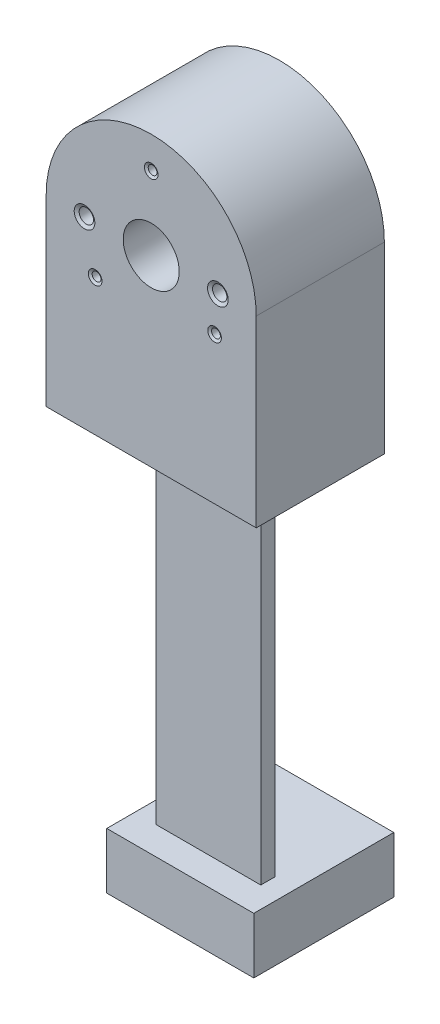
ISO-10303-21;
HEADER;
FILE_DESCRIPTION(('STEP AP214'),'2;1');
FILE_NAME('part.step','',(''),(''),'','','');
FILE_SCHEMA(('AUTOMOTIVE_DESIGN { 1 0 10303 214 1 1 1 1 }'));
ENDSEC;
DATA;
#1=APPLICATION_CONTEXT('core data for automotive mechanical design processes');
#2=APPLICATION_PROTOCOL_DEFINITION('international standard','automotive_design',2000,#1);
#3=PRODUCT_CONTEXT('',#1,'mechanical');
#4=PRODUCT('Part','Part','',(#3));
#5=PRODUCT_RELATED_PRODUCT_CATEGORY('part','',(#4));
#6=PRODUCT_DEFINITION_FORMATION('','',#4);
#7=PRODUCT_DEFINITION_CONTEXT('part definition',#1,'design');
#8=PRODUCT_DEFINITION('design','',#6,#7);
#9=PRODUCT_DEFINITION_SHAPE('','',#8);
#10=(LENGTH_UNIT() NAMED_UNIT(*) SI_UNIT(.MILLI.,.METRE.));
#11=(NAMED_UNIT(*) PLANE_ANGLE_UNIT() SI_UNIT($,.RADIAN.));
#12=(NAMED_UNIT(*) SI_UNIT($,.STERADIAN.) SOLID_ANGLE_UNIT());
#13=UNCERTAINTY_MEASURE_WITH_UNIT(LENGTH_MEASURE(1.E-05),#10,'distance_accuracy_value','');
#14=(GEOMETRIC_REPRESENTATION_CONTEXT(3) GLOBAL_UNCERTAINTY_ASSIGNED_CONTEXT((#13)) GLOBAL_UNIT_ASSIGNED_CONTEXT((#10,
#11,#12)) REPRESENTATION_CONTEXT('',''));
#15=CARTESIAN_POINT('',(0.,0.,0.));
#16=DIRECTION('',(0.,0.,1.));
#17=DIRECTION('',(1.,0.,0.));
#18=AXIS2_PLACEMENT_3D('',#15,#16,#17);
#19=CARTESIAN_POINT('',(-315.950034530453,190.975,13.3000000000152));
#20=DIRECTION('',(0.,0.,1.));
#21=DIRECTION('',(1.,0.,0.));
#22=AXIS2_PLACEMENT_3D('',#19,#20,#21);
#23=CONICAL_SURFACE('',#22,0.625000000092579,1.02974425865527);
#24=CARTESIAN_POINT('',(-315.950034530346,190.975,12.9244621130056));
#25=VERTEX_POINT('',#24);
#26=VERTEX_LOOP('',#25);
#27=FACE_BOUND('',#26,.T.);
#28=CARTESIAN_POINT('',(-315.950034530453,190.975,13.3));
#29=DIRECTION('',(0.,0.,1.));
#30=DIRECTION('',(1.,0.,0.));
#31=AXIS2_PLACEMENT_3D('',#28,#29,#30);
#32=CIRCLE('',#31,0.625);
#33=CARTESIAN_POINT('',(-315.325034530453,190.975,13.3));
#34=VERTEX_POINT('',#33);
#35=EDGE_CURVE('E115',#34,#34,#32,.T.);
#36=ORIENTED_EDGE('',*,*,#35,.T.);
#37=EDGE_LOOP('',(#36));
#38=FACE_BOUND('',#37,.T.);
#39=ADVANCED_FACE('F17',(#27,#38),#23,.F.);
#40=CARTESIAN_POINT('',(-315.475,196.2,10.8000000000175));
#41=DIRECTION('',(0.,0.,1.));
#42=DIRECTION('',(1.,0.,0.));
#43=AXIS2_PLACEMENT_3D('',#40,#41,#42);
#44=CONICAL_SURFACE('',#43,1.0249999999779,1.02974425866427);
#45=CARTESIAN_POINT('',(-315.475000000049,196.2,10.1841178655206));
#46=VERTEX_POINT('',#45);
#47=VERTEX_LOOP('',#46);
#48=FACE_BOUND('',#47,.T.);
#49=CARTESIAN_POINT('',(-315.475,196.2,10.8));
#50=DIRECTION('',(0.,0.,1.));
#51=DIRECTION('',(1.,0.,0.));
#52=AXIS2_PLACEMENT_3D('',#49,#50,#51);
#53=CIRCLE('',#52,1.025);
#54=CARTESIAN_POINT('',(-314.45,196.2,10.8));
#55=VERTEX_POINT('',#54);
#56=EDGE_CURVE('E117',#55,#55,#53,.T.);
#57=ORIENTED_EDGE('',*,*,#56,.T.);
#58=EDGE_LOOP('',(#57));
#59=FACE_BOUND('',#58,.T.);
#60=ADVANCED_FACE('F112',(#48,#59),#44,.F.);
#61=CARTESIAN_POINT('',(-333.005164430593,189.482869478776,13.300000000072));
#62=DIRECTION('',(0.,0.,1.));
#63=DIRECTION('',(1.,0.,0.));
#64=AXIS2_PLACEMENT_3D('',#61,#62,#63);
#65=CONICAL_SURFACE('',#64,0.625000000032627,1.02974425868194);
#66=CARTESIAN_POINT('',(-333.005164430517,189.482869478776,12.9244621131761));
#67=VERTEX_POINT('',#66);
#68=VERTEX_LOOP('',#67);
#69=FACE_BOUND('',#68,.T.);
#70=CARTESIAN_POINT('',(-333.005164430593,189.482869478776,13.3));
#71=DIRECTION('',(0.,0.,1.));
#72=DIRECTION('',(1.,0.,0.));
#73=AXIS2_PLACEMENT_3D('',#70,#71,#72);
#74=CIRCLE('',#73,0.625);
#75=CARTESIAN_POINT('',(-332.380164430593,189.482869478776,13.3));
#76=VERTEX_POINT('',#75);
#77=EDGE_CURVE('E120',#76,#76,#74,.T.);
#78=ORIENTED_EDGE('',*,*,#77,.T.);
#79=EDGE_LOOP('',(#78));
#80=FACE_BOUND('',#79,.T.);
#81=ADVANCED_FACE('F233',(#69,#80),#65,.F.);
#82=CARTESIAN_POINT('',(-334.525,196.2,10.8000000001311));
#83=DIRECTION('',(0.,0.,1.));
#84=DIRECTION('',(1.,0.,0.));
#85=AXIS2_PLACEMENT_3D('',#82,#83,#84);
#86=CONICAL_SURFACE('',#85,1.02500000015548,1.02974425865623);
#87=CARTESIAN_POINT('',(-334.525000000127,196.2,10.1841178655491));
#88=VERTEX_POINT('',#87);
#89=VERTEX_LOOP('',#88);
#90=FACE_BOUND('',#89,.T.);
#91=CARTESIAN_POINT('',(-334.525,196.2,10.8));
#92=DIRECTION('',(0.,0.,1.));
#93=DIRECTION('',(1.,0.,0.));
#94=AXIS2_PLACEMENT_3D('',#91,#92,#93);
#95=CIRCLE('',#94,1.025);
#96=CARTESIAN_POINT('',(-333.5,196.2,10.8));
#97=VERTEX_POINT('',#96);
#98=EDGE_CURVE('E228',#97,#97,#95,.T.);
#99=ORIENTED_EDGE('',*,*,#98,.T.);
#100=EDGE_LOOP('',(#99));
#101=FACE_BOUND('',#100,.T.);
#102=ADVANCED_FACE('F359',(#90,#101),#86,.F.);
#103=CARTESIAN_POINT('',(-325.,206.65,13.2999999999583));
#104=DIRECTION('',(0.,0.,1.));
#105=DIRECTION('',(0.,-1.,0.));
#106=AXIS2_PLACEMENT_3D('',#103,#104,#105);
#107=CONICAL_SURFACE('',#106,0.624999999968179,1.02974425861771);
#108=CARTESIAN_POINT('',(-324.999999999932,206.65,12.9244621130908));
#109=VERTEX_POINT('',#108);
#110=VERTEX_LOOP('',#109);
#111=FACE_BOUND('',#110,.T.);
#112=CARTESIAN_POINT('',(-325.,206.65,13.3));
#113=DIRECTION('',(0.,0.,1.));
#114=DIRECTION('',(1.,0.,0.));
#115=AXIS2_PLACEMENT_3D('',#112,#113,#114);
#116=CIRCLE('',#115,0.625);
#117=CARTESIAN_POINT('',(-324.375,206.65,13.3));
#118=VERTEX_POINT('',#117);
#119=EDGE_CURVE('E225',#118,#118,#116,.T.);
#120=ORIENTED_EDGE('',*,*,#119,.T.);
#121=EDGE_LOOP('',(#120));
#122=FACE_BOUND('',#121,.T.);
#123=ADVANCED_FACE('F355',(#111,#122),#107,.F.);
#124=CARTESIAN_POINT('',(-325.,110.,9.15));
#125=DIRECTION('',(0.,-1.,0.));
#126=DIRECTION('',(0.,0.,-1.));
#127=AXIS2_PLACEMENT_3D('',#124,#125,#126);
#128=PLANE('',#127);
#129=DIRECTION('',(-1.,0.,0.));
#130=VECTOR('',#129,1.);
#131=CARTESIAN_POINT('',(-332.5,110.,14.15));
#132=LINE('',#131,#130);
#133=CARTESIAN_POINT('',(-314.5,110.,14.15));
#134=VERTEX_POINT('',#133);
#135=CARTESIAN_POINT('',(-335.5,110.,14.15));
#136=VERTEX_POINT('',#135);
#137=EDGE_CURVE('E190',#134,#136,#132,.T.);
#138=ORIENTED_EDGE('',*,*,#137,.T.);
#139=DIRECTION('',(0.,0.,1.));
#140=VECTOR('',#139,1.);
#141=CARTESIAN_POINT('',(-335.5,110.,9.15));
#142=LINE('',#141,#140);
#143=CARTESIAN_POINT('',(-335.5,110.,-5.85));
#144=VERTEX_POINT('',#143);
#145=EDGE_CURVE('E223',#144,#136,#142,.T.);
#146=ORIENTED_EDGE('',*,*,#145,.F.);
#147=DIRECTION('',(1.,0.,0.));
#148=VECTOR('',#147,1.);
#149=CARTESIAN_POINT('',(-332.5,110.,-5.85));
#150=LINE('',#149,#148);
#151=CARTESIAN_POINT('',(-314.5,110.,-5.85));
#152=VERTEX_POINT('',#151);
#153=EDGE_CURVE('E218',#144,#152,#150,.T.);
#154=ORIENTED_EDGE('',*,*,#153,.T.);
#155=DIRECTION('',(0.,0.,1.));
#156=VECTOR('',#155,1.);
#157=CARTESIAN_POINT('',(-314.5,110.,9.15));
#158=LINE('',#157,#156);
#159=EDGE_CURVE('E213',#152,#134,#158,.T.);
#160=ORIENTED_EDGE('',*,*,#159,.T.);
#161=EDGE_LOOP('',(#138,#146,#154,#160));
#162=FACE_BOUND('',#161,.T.);
#163=ADVANCED_FACE('F351',(#162),#128,.T.);
#164=CARTESIAN_POINT('',(-335.5,140.,9.15));
#165=DIRECTION('',(-1.,0.,0.));
#166=DIRECTION('',(0.,0.,1.));
#167=AXIS2_PLACEMENT_3D('',#164,#165,#166);
#168=PLANE('',#167);
#169=ORIENTED_EDGE('',*,*,#145,.T.);
#170=DIRECTION('',(0.,1.,0.));
#171=VECTOR('',#170,1.);
#172=CARTESIAN_POINT('',(-335.5,118.,14.15));
#173=LINE('',#172,#171);
#174=CARTESIAN_POINT('',(-335.5,118.,14.15));
#175=VERTEX_POINT('',#174);
#176=EDGE_CURVE('E210',#136,#175,#173,.T.);
#177=ORIENTED_EDGE('',*,*,#176,.T.);
#178=DIRECTION('',(0.,0.,-1.));
#179=VECTOR('',#178,1.);
#180=CARTESIAN_POINT('',(-335.5,118.,-5.85));
#181=LINE('',#180,#179);
#182=CARTESIAN_POINT('',(-335.5,118.,-5.85));
#183=VERTEX_POINT('',#182);
#184=EDGE_CURVE('E187',#175,#183,#181,.T.);
#185=ORIENTED_EDGE('',*,*,#184,.T.);
#186=DIRECTION('',(0.,1.,0.));
#187=VECTOR('',#186,1.);
#188=CARTESIAN_POINT('',(-335.5,110.,-5.85));
#189=LINE('',#188,#187);
#190=EDGE_CURVE('E220',#183,#144,#189,.F.);
#191=ORIENTED_EDGE('',*,*,#190,.T.);
#192=EDGE_LOOP('',(#169,#177,#185,#191));
#193=FACE_BOUND('',#192,.T.);
#194=ADVANCED_FACE('F347',(#193),#168,.T.);
#195=CARTESIAN_POINT('',(-332.5,110.,-5.85));
#196=DIRECTION('',(0.,0.,1.));
#197=DIRECTION('',(1.,0.,0.));
#198=AXIS2_PLACEMENT_3D('',#195,#196,#197);
#199=PLANE('',#198);
#200=DIRECTION('',(0.,1.,0.));
#201=VECTOR('',#200,1.);
#202=CARTESIAN_POINT('',(-314.5,140.,-5.85));
#203=LINE('',#202,#201);
#204=CARTESIAN_POINT('',(-314.5,118.,-5.85));
#205=VERTEX_POINT('',#204);
#206=EDGE_CURVE('E215',#205,#152,#203,.F.);
#207=ORIENTED_EDGE('',*,*,#206,.T.);
#208=ORIENTED_EDGE('',*,*,#153,.F.);
#209=ORIENTED_EDGE('',*,*,#190,.F.);
#210=DIRECTION('',(1.,0.,0.));
#211=VECTOR('',#210,1.);
#212=CARTESIAN_POINT('',(-332.5,118.,-5.85));
#213=LINE('',#212,#211);
#214=EDGE_CURVE('E184',#183,#205,#213,.T.);
#215=ORIENTED_EDGE('',*,*,#214,.T.);
#216=EDGE_LOOP('',(#207,#208,#209,#215));
#217=FACE_BOUND('',#216,.T.);
#218=ADVANCED_FACE('F343',(#217),#199,.F.);
#219=CARTESIAN_POINT('',(-314.5,140.,9.15));
#220=DIRECTION('',(-1.,0.,0.));
#221=DIRECTION('',(0.,0.,1.));
#222=AXIS2_PLACEMENT_3D('',#219,#220,#221);
#223=PLANE('',#222);
#224=ORIENTED_EDGE('',*,*,#159,.F.);
#225=ORIENTED_EDGE('',*,*,#206,.F.);
#226=DIRECTION('',(0.,0.,-1.));
#227=VECTOR('',#226,1.);
#228=CARTESIAN_POINT('',(-314.5,118.,-5.85));
#229=LINE('',#228,#227);
#230=CARTESIAN_POINT('',(-314.5,118.,14.15));
#231=VERTEX_POINT('',#230);
#232=EDGE_CURVE('E181',#205,#231,#229,.F.);
#233=ORIENTED_EDGE('',*,*,#232,.T.);
#234=DIRECTION('',(0.,1.,0.));
#235=VECTOR('',#234,1.);
#236=CARTESIAN_POINT('',(-314.5,118.,14.15));
#237=LINE('',#236,#235);
#238=EDGE_CURVE('E207',#231,#134,#237,.F.);
#239=ORIENTED_EDGE('',*,*,#238,.T.);
#240=EDGE_LOOP('',(#224,#225,#233,#239));
#241=FACE_BOUND('',#240,.T.);
#242=ADVANCED_FACE('F339',(#241),#223,.F.);
#243=CARTESIAN_POINT('',(-332.5,118.,14.15));
#244=DIRECTION('',(0.,0.,-1.));
#245=DIRECTION('',(-1.,0.,0.));
#246=AXIS2_PLACEMENT_3D('',#243,#244,#245);
#247=PLANE('',#246);
#248=ORIENTED_EDGE('',*,*,#238,.F.);
#249=DIRECTION('',(1.,0.,0.));
#250=VECTOR('',#249,1.);
#251=CARTESIAN_POINT('',(-332.5,118.,14.15));
#252=LINE('',#251,#250);
#253=EDGE_CURVE('E177',#231,#175,#252,.F.);
#254=ORIENTED_EDGE('',*,*,#253,.T.);
#255=ORIENTED_EDGE('',*,*,#176,.F.);
#256=ORIENTED_EDGE('',*,*,#137,.F.);
#257=EDGE_LOOP('',(#248,#254,#255,#256));
#258=FACE_BOUND('',#257,.T.);
#259=ADVANCED_FACE('F336',(#258),#247,.F.);
#260=CARTESIAN_POINT('',(-315.950034530453,190.975,18.3));
#261=DIRECTION('',(0.,0.,1.));
#262=DIRECTION('',(1.,0.,0.));
#263=AXIS2_PLACEMENT_3D('',#260,#261,#262);
#264=CYLINDRICAL_SURFACE('',#263,0.625);
#265=ORIENTED_EDGE('',*,*,#35,.F.);
#266=EDGE_LOOP('',(#265));
#267=FACE_BOUND('',#266,.T.);
#268=CARTESIAN_POINT('',(-315.950034530453,190.975,18.100000000004));
#269=DIRECTION('',(0.,0.,1.));
#270=DIRECTION('',(1.,0.,0.));
#271=AXIS2_PLACEMENT_3D('',#268,#269,#270);
#272=CIRCLE('',#271,0.624999999978892);
#273=CARTESIAN_POINT('',(-315.325034530474,190.975,18.100000000004));
#274=VERTEX_POINT('',#273);
#275=EDGE_CURVE('E180',#274,#274,#272,.T.);
#276=ORIENTED_EDGE('',*,*,#275,.T.);
#277=EDGE_LOOP('',(#276));
#278=FACE_BOUND('',#277,.T.);
#279=ADVANCED_FACE('F332',(#267,#278),#264,.F.);
#280=CARTESIAN_POINT('',(-315.475,196.2,18.3));
#281=DIRECTION('',(0.,0.,1.));
#282=DIRECTION('',(1.,0.,0.));
#283=AXIS2_PLACEMENT_3D('',#280,#281,#282);
#284=CYLINDRICAL_SURFACE('',#283,1.025);
#285=ORIENTED_EDGE('',*,*,#56,.F.);
#286=EDGE_LOOP('',(#285));
#287=FACE_BOUND('',#286,.T.);
#288=CARTESIAN_POINT('',(-315.475,196.2,18.0401923789191));
#289=DIRECTION('',(0.,0.,1.));
#290=DIRECTION('',(1.,0.,0.));
#291=AXIS2_PLACEMENT_3D('',#288,#289,#290);
#292=CIRCLE('',#291,1.0249999999779);
#293=CARTESIAN_POINT('',(-314.450000000022,196.2,18.0401923789191));
#294=VERTEX_POINT('',#293);
#295=EDGE_CURVE('E200',#294,#294,#292,.T.);
#296=ORIENTED_EDGE('',*,*,#295,.T.);
#297=EDGE_LOOP('',(#296));
#298=FACE_BOUND('',#297,.T.);
#299=ADVANCED_FACE('F239',(#287,#298),#284,.F.);
#300=CARTESIAN_POINT('',(-333.005164430593,189.482869478776,18.3));
#301=DIRECTION('',(0.,0.,1.));
#302=DIRECTION('',(1.,0.,0.));
#303=AXIS2_PLACEMENT_3D('',#300,#301,#302);
#304=CYLINDRICAL_SURFACE('',#303,0.625);
#305=ORIENTED_EDGE('',*,*,#77,.F.);
#306=EDGE_LOOP('',(#305));
#307=FACE_BOUND('',#306,.T.);
#308=CARTESIAN_POINT('',(-333.005164430593,189.482869478776,18.1000000000608));
#309=DIRECTION('',(0.,0.,1.));
#310=DIRECTION('',(1.,0.,0.));
#311=AXIS2_PLACEMENT_3D('',#308,#309,#310);
#312=CIRCLE('',#311,0.625000000032627);
#313=CARTESIAN_POINT('',(-332.38016443056,189.482869478776,18.1000000000608));
#314=VERTEX_POINT('',#313);
#315=EDGE_CURVE('E197',#314,#314,#312,.T.);
#316=ORIENTED_EDGE('',*,*,#315,.T.);
#317=EDGE_LOOP('',(#316));
#318=FACE_BOUND('',#317,.T.);
#319=ADVANCED_FACE('F235',(#307,#318),#304,.F.);
#320=CARTESIAN_POINT('',(-334.525,196.2,18.3));
#321=DIRECTION('',(0.,0.,1.));
#322=DIRECTION('',(1.,0.,0.));
#323=AXIS2_PLACEMENT_3D('',#320,#321,#322);
#324=CYLINDRICAL_SURFACE('',#323,1.025);
#325=ORIENTED_EDGE('',*,*,#98,.F.);
#326=EDGE_LOOP('',(#325));
#327=FACE_BOUND('',#326,.T.);
#328=CARTESIAN_POINT('',(-334.525,196.2,18.0401923788622));
#329=DIRECTION('',(0.,0.,1.));
#330=DIRECTION('',(1.,0.,0.));
#331=AXIS2_PLACEMENT_3D('',#328,#329,#330);
#332=CIRCLE('',#331,1.02499999998495);
#333=CARTESIAN_POINT('',(-333.500000000015,196.2,18.0401923788622));
#334=VERTEX_POINT('',#333);
#335=EDGE_CURVE('E194',#334,#334,#332,.T.);
#336=ORIENTED_EDGE('',*,*,#335,.T.);
#337=EDGE_LOOP('',(#336));
#338=FACE_BOUND('',#337,.T.);
#339=ADVANCED_FACE('F238',(#327,#338),#324,.F.);
#340=CARTESIAN_POINT('',(-325.,206.65,18.3));
#341=DIRECTION('',(0.,0.,1.));
#342=DIRECTION('',(1.,0.,0.));
#343=AXIS2_PLACEMENT_3D('',#340,#341,#342);
#344=CYLINDRICAL_SURFACE('',#343,0.625);
#345=ORIENTED_EDGE('',*,*,#119,.F.);
#346=EDGE_LOOP('',(#345));
#347=FACE_BOUND('',#346,.T.);
#348=CARTESIAN_POINT('',(-325.,206.65,18.100000000004));
#349=DIRECTION('',(0.,0.,1.));
#350=DIRECTION('',(1.,0.,0.));
#351=AXIS2_PLACEMENT_3D('',#348,#349,#350);
#352=CIRCLE('',#351,0.624999999968179);
#353=CARTESIAN_POINT('',(-324.375000000032,206.65,18.100000000004));
#354=VERTEX_POINT('',#353);
#355=EDGE_CURVE('E191',#354,#354,#352,.T.);
#356=ORIENTED_EDGE('',*,*,#355,.T.);
#357=EDGE_LOOP('',(#356));
#358=FACE_BOUND('',#357,.T.);
#359=ADVANCED_FACE('F313',(#347,#358),#344,.F.);
#360=CARTESIAN_POINT('',(-325.,190.6,3.8));
#361=DIRECTION('',(0.,0.,1.));
#362=DIRECTION('',(1.,0.,0.));
#363=AXIS2_PLACEMENT_3D('',#360,#361,#362);
#364=PLANE('',#363);
#365=CARTESIAN_POINT('',(-325.,196.2,3.8));
#366=DIRECTION('',(0.,0.,1.));
#367=DIRECTION('',(1.,0.,0.));
#368=AXIS2_PLACEMENT_3D('',#365,#366,#367);
#369=CIRCLE('',#368,4.);
#370=CARTESIAN_POINT('',(-321.,196.2,3.8));
#371=VERTEX_POINT('',#370);
#372=EDGE_CURVE('E20',#371,#371,#369,.T.);
#373=ORIENTED_EDGE('',*,*,#372,.T.);
#374=EDGE_LOOP('',(#373));
#375=FACE_BOUND('',#374,.T.);
#376=ADVANCED_FACE('F315',(#375),#364,.T.);
#377=CARTESIAN_POINT('',(-332.5,118.,-5.85));
#378=DIRECTION('',(0.,-1.,0.));
#379=DIRECTION('',(0.,0.,-1.));
#380=AXIS2_PLACEMENT_3D('',#377,#378,#379);
#381=PLANE('',#380);
#382=DIRECTION('',(-1.,0.,0.));
#383=VECTOR('',#382,1.);
#384=CARTESIAN_POINT('',(-317.5,118.,8.15));
#385=LINE('',#384,#383);
#386=CARTESIAN_POINT('',(-317.5,118.,8.15));
#387=VERTEX_POINT('',#386);
#388=CARTESIAN_POINT('',(-332.5,118.,8.15));
#389=VERTEX_POINT('',#388);
#390=EDGE_CURVE('E168',#387,#389,#385,.T.);
#391=ORIENTED_EDGE('',*,*,#390,.F.);
#392=DIRECTION('',(0.,0.,-1.));
#393=VECTOR('',#392,1.);
#394=CARTESIAN_POINT('',(-317.5,118.,10.15));
#395=LINE('',#394,#393);
#396=CARTESIAN_POINT('',(-317.5,118.,10.15));
#397=VERTEX_POINT('',#396);
#398=EDGE_CURVE('E174',#397,#387,#395,.T.);
#399=ORIENTED_EDGE('',*,*,#398,.F.);
#400=DIRECTION('',(1.,0.,0.));
#401=VECTOR('',#400,1.);
#402=CARTESIAN_POINT('',(-332.5,118.,10.15));
#403=LINE('',#402,#401);
#404=CARTESIAN_POINT('',(-332.5,118.,10.15));
#405=VERTEX_POINT('',#404);
#406=EDGE_CURVE('E147',#405,#397,#403,.T.);
#407=ORIENTED_EDGE('',*,*,#406,.F.);
#408=DIRECTION('',(0.,0.,1.));
#409=VECTOR('',#408,1.);
#410=CARTESIAN_POINT('',(-332.5,118.,8.15));
#411=LINE('',#410,#409);
#412=EDGE_CURVE('E162',#389,#405,#411,.T.);
#413=ORIENTED_EDGE('',*,*,#412,.F.);
#414=EDGE_LOOP('',(#391,#399,#407,#413));
#415=FACE_BOUND('',#414,.T.);
#416=ORIENTED_EDGE('',*,*,#232,.F.);
#417=ORIENTED_EDGE('',*,*,#214,.F.);
#418=ORIENTED_EDGE('',*,*,#184,.F.);
#419=ORIENTED_EDGE('',*,*,#253,.F.);
#420=EDGE_LOOP('',(#416,#417,#418,#419));
#421=FACE_BOUND('',#420,.T.);
#422=ADVANCED_FACE('F322',(#415,#421),#381,.F.);
#423=CARTESIAN_POINT('',(-315.950034530453,190.975,18.299999999897));
#424=DIRECTION('',(0.,0.,1.));
#425=DIRECTION('',(1.,0.,0.));
#426=AXIS2_PLACEMENT_3D('',#423,#424,#425);
#427=CONICAL_SURFACE('',#426,0.971410161320629,1.04719755123235);
#428=CARTESIAN_POINT('',(-315.950034530453,190.975,18.3000000000155));
#429=DIRECTION('',(0.,0.,1.));
#430=DIRECTION('',(1.,0.,0.));
#431=AXIS2_PLACEMENT_3D('',#428,#429,#430);
#432=CIRCLE('',#431,0.97141016152591);
#433=CARTESIAN_POINT('',(-314.978624368927,190.975,18.3000000000155));
#434=VERTEX_POINT('',#433);
#435=EDGE_CURVE('E141',#434,#434,#432,.F.);
#436=ORIENTED_EDGE('',*,*,#435,.F.);
#437=EDGE_LOOP('',(#436));
#438=FACE_BOUND('',#437,.T.);
#439=ORIENTED_EDGE('',*,*,#275,.F.);
#440=EDGE_LOOP('',(#439));
#441=FACE_BOUND('',#440,.T.);
#442=ADVANCED_FACE('F257',(#438,#441),#427,.F.);
#443=CARTESIAN_POINT('',(-315.475,196.2,18.3000000000675));
#444=DIRECTION('',(0.,0.,1.));
#445=DIRECTION('',(1.,0.,0.));
#446=AXIS2_PLACEMENT_3D('',#443,#444,#445);
#447=CONICAL_SURFACE('',#446,1.47500000003548,1.04719755119015);
#448=CARTESIAN_POINT('',(-315.475,196.2,18.300000000063));
#449=DIRECTION('',(0.,0.,1.));
#450=DIRECTION('',(1.,0.,0.));
#451=AXIS2_PLACEMENT_3D('',#448,#449,#450);
#452=CIRCLE('',#451,1.47500000002765);
#453=CARTESIAN_POINT('',(-313.999999999972,196.2,18.300000000063));
#454=VERTEX_POINT('',#453);
#455=EDGE_CURVE('E139',#454,#454,#452,.F.);
#456=ORIENTED_EDGE('',*,*,#455,.F.);
#457=EDGE_LOOP('',(#456));
#458=FACE_BOUND('',#457,.T.);
#459=ORIENTED_EDGE('',*,*,#295,.F.);
#460=EDGE_LOOP('',(#459));
#461=FACE_BOUND('',#460,.T.);
#462=ADVANCED_FACE('F246',(#458,#461),#447,.F.);
#463=CARTESIAN_POINT('',(-333.005164430593,189.482869478776,18.299999999897));
#464=DIRECTION('',(0.,0.,1.));
#465=DIRECTION('',(1.,0.,0.));
#466=AXIS2_PLACEMENT_3D('',#463,#464,#465);
#467=CONICAL_SURFACE('',#466,0.971410161260677,1.04719755121331);
#468=CARTESIAN_POINT('',(-333.005164430593,189.482869478776,18.3000000000173));
#469=DIRECTION('',(0.,0.,1.));
#470=DIRECTION('',(1.,0.,0.));
#471=AXIS2_PLACEMENT_3D('',#468,#469,#470);
#472=CIRCLE('',#471,0.971410161469066);
#473=CARTESIAN_POINT('',(-332.033754269124,189.482869478776,18.3000000000173));
#474=VERTEX_POINT('',#473);
#475=EDGE_CURVE('E136',#474,#474,#472,.F.);
#476=ORIENTED_EDGE('',*,*,#475,.F.);
#477=EDGE_LOOP('',(#476));
#478=FACE_BOUND('',#477,.T.);
#479=ORIENTED_EDGE('',*,*,#315,.F.);
#480=EDGE_LOOP('',(#479));
#481=FACE_BOUND('',#480,.T.);
#482=ADVANCED_FACE('F243',(#478,#481),#467,.F.);
#483=CARTESIAN_POINT('',(-334.525,196.2,18.2999999999538));
#484=DIRECTION('',(0.,0.,1.));
#485=DIRECTION('',(1.,0.,0.));
#486=AXIS2_PLACEMENT_3D('',#483,#484,#485);
#487=CONICAL_SURFACE('',#486,1.474999999872,1.04719755116084);
#488=CARTESIAN_POINT('',(-334.525,196.2,18.3000000000437));
#489=DIRECTION('',(0.,0.,1.));
#490=DIRECTION('',(1.,0.,0.));
#491=AXIS2_PLACEMENT_3D('',#488,#489,#490);
#492=CIRCLE('',#491,1.47500000002765);
#493=CARTESIAN_POINT('',(-333.049999999972,196.2,18.3000000000437));
#494=VERTEX_POINT('',#493);
#495=EDGE_CURVE('E133',#494,#494,#492,.F.);
#496=ORIENTED_EDGE('',*,*,#495,.F.);
#497=EDGE_LOOP('',(#496));
#498=FACE_BOUND('',#497,.T.);
#499=ORIENTED_EDGE('',*,*,#335,.F.);
#500=EDGE_LOOP('',(#499));
#501=FACE_BOUND('',#500,.T.);
#502=ADVANCED_FACE('F245',(#498,#501),#487,.F.);
#503=CARTESIAN_POINT('',(-325.,206.65,18.2999999999538));
#504=DIRECTION('',(0.,0.,1.));
#505=DIRECTION('',(1.,0.,0.));
#506=AXIS2_PLACEMENT_3D('',#503,#504,#505);
#507=CONICAL_SURFACE('',#506,0.971410161423603,1.04719755118034);
#508=CARTESIAN_POINT('',(-325.,206.65,18.3000000000129));
#509=DIRECTION('',(0.,0.,1.));
#510=DIRECTION('',(1.,0.,0.));
#511=AXIS2_PLACEMENT_3D('',#508,#509,#510);
#512=CIRCLE('',#511,0.97141016152591);
#513=CARTESIAN_POINT('',(-324.028589838474,206.65,18.3000000000129));
#514=VERTEX_POINT('',#513);
#515=EDGE_CURVE('E130',#514,#514,#512,.F.);
#516=ORIENTED_EDGE('',*,*,#515,.F.);
#517=EDGE_LOOP('',(#516));
#518=FACE_BOUND('',#517,.T.);
#519=ORIENTED_EDGE('',*,*,#355,.F.);
#520=EDGE_LOOP('',(#519));
#521=FACE_BOUND('',#520,.T.);
#522=ADVANCED_FACE('F254',(#518,#521),#507,.F.);
#523=CARTESIAN_POINT('',(-325.,196.2,18.3));
#524=DIRECTION('',(0.,0.,1.));
#525=DIRECTION('',(1.,0.,0.));
#526=AXIS2_PLACEMENT_3D('',#523,#524,#525);
#527=CYLINDRICAL_SURFACE('',#526,4.);
#528=CARTESIAN_POINT('',(-325.,196.2,18.3));
#529=DIRECTION('',(0.,0.,1.));
#530=DIRECTION('',(1.,0.,0.));
#531=AXIS2_PLACEMENT_3D('',#528,#529,#530);
#532=CIRCLE('',#531,4.);
#533=CARTESIAN_POINT('',(-321.,196.2,18.3));
#534=VERTEX_POINT('',#533);
#535=EDGE_CURVE('E127',#534,#534,#532,.F.);
#536=ORIENTED_EDGE('',*,*,#535,.F.);
#537=EDGE_LOOP('',(#536));
#538=FACE_BOUND('',#537,.T.);
#539=ORIENTED_EDGE('',*,*,#372,.F.);
#540=EDGE_LOOP('',(#539));
#541=FACE_BOUND('',#540,.T.);
#542=ADVANCED_FACE('F300',(#538,#541),#527,.F.);
#543=CARTESIAN_POINT('',(-317.5,170.,10.15));
#544=DIRECTION('',(1.,0.,0.));
#545=DIRECTION('',(0.,0.,-1.));
#546=AXIS2_PLACEMENT_3D('',#543,#544,#545);
#547=PLANE('',#546);
#548=ORIENTED_EDGE('',*,*,#398,.T.);
#549=DIRECTION('',(0.,1.,0.));
#550=VECTOR('',#549,1.);
#551=CARTESIAN_POINT('',(-317.5,170.,8.15));
#552=LINE('',#551,#550);
#553=CARTESIAN_POINT('',(-317.5,170.,8.15));
#554=VERTEX_POINT('',#553);
#555=EDGE_CURVE('E171',#554,#387,#552,.F.);
#556=ORIENTED_EDGE('',*,*,#555,.F.);
#557=DIRECTION('',(0.,0.,-1.));
#558=VECTOR('',#557,1.);
#559=CARTESIAN_POINT('',(-317.5,170.,0.));
#560=LINE('',#559,#558);
#561=CARTESIAN_POINT('',(-317.5,170.,10.15));
#562=VERTEX_POINT('',#561);
#563=EDGE_CURVE('E577',#562,#554,#560,.T.);
#564=ORIENTED_EDGE('',*,*,#563,.F.);
#565=DIRECTION('',(0.,1.,0.));
#566=VECTOR('',#565,1.);
#567=CARTESIAN_POINT('',(-317.5,170.,10.15));
#568=LINE('',#567,#566);
#569=EDGE_CURVE('E143',#397,#562,#568,.T.);
#570=ORIENTED_EDGE('',*,*,#569,.F.);
#571=EDGE_LOOP('',(#548,#556,#564,#570));
#572=FACE_BOUND('',#571,.T.);
#573=ADVANCED_FACE('F296',(#572),#547,.T.);
#574=CARTESIAN_POINT('',(-317.5,170.,8.15));
#575=DIRECTION('',(0.,0.,-1.));
#576=DIRECTION('',(-1.,0.,0.));
#577=AXIS2_PLACEMENT_3D('',#574,#575,#576);
#578=PLANE('',#577);
#579=ORIENTED_EDGE('',*,*,#390,.T.);
#580=DIRECTION('',(0.,1.,0.));
#581=VECTOR('',#580,1.);
#582=CARTESIAN_POINT('',(-332.5,170.,8.15));
#583=LINE('',#582,#581);
#584=CARTESIAN_POINT('',(-332.5,170.,8.15));
#585=VERTEX_POINT('',#584);
#586=EDGE_CURVE('E165',#585,#389,#583,.F.);
#587=ORIENTED_EDGE('',*,*,#586,.F.);
#588=DIRECTION('',(1.,0.,0.));
#589=VECTOR('',#588,1.);
#590=CARTESIAN_POINT('',(-310.,170.,8.15));
#591=LINE('',#590,#589);
#592=EDGE_CURVE('E574',#554,#585,#591,.F.);
#593=ORIENTED_EDGE('',*,*,#592,.F.);
#594=ORIENTED_EDGE('',*,*,#555,.T.);
#595=EDGE_LOOP('',(#579,#587,#593,#594));
#596=FACE_BOUND('',#595,.T.);
#597=ADVANCED_FACE('F292',(#596),#578,.T.);
#598=CARTESIAN_POINT('',(-332.5,170.,8.15));
#599=DIRECTION('',(-1.,0.,0.));
#600=DIRECTION('',(0.,0.,1.));
#601=AXIS2_PLACEMENT_3D('',#598,#599,#600);
#602=PLANE('',#601);
#603=ORIENTED_EDGE('',*,*,#412,.T.);
#604=DIRECTION('',(0.,1.,0.));
#605=VECTOR('',#604,1.);
#606=CARTESIAN_POINT('',(-332.5,170.,10.15));
#607=LINE('',#606,#605);
#608=CARTESIAN_POINT('',(-332.5,170.,10.15));
#609=VERTEX_POINT('',#608);
#610=EDGE_CURVE('E154',#609,#405,#607,.F.);
#611=ORIENTED_EDGE('',*,*,#610,.F.);
#612=DIRECTION('',(0.,0.,-1.));
#613=VECTOR('',#612,1.);
#614=CARTESIAN_POINT('',(-332.5,170.,0.));
#615=LINE('',#614,#613);
#616=EDGE_CURVE('E569',#585,#609,#615,.F.);
#617=ORIENTED_EDGE('',*,*,#616,.F.);
#618=ORIENTED_EDGE('',*,*,#586,.T.);
#619=EDGE_LOOP('',(#603,#611,#617,#618));
#620=FACE_BOUND('',#619,.T.);
#621=ADVANCED_FACE('F289',(#620),#602,.T.);
#622=CARTESIAN_POINT('',(-332.5,170.,10.15));
#623=DIRECTION('',(0.,0.,1.));
#624=DIRECTION('',(1.,0.,0.));
#625=AXIS2_PLACEMENT_3D('',#622,#623,#624);
#626=PLANE('',#625);
#627=ORIENTED_EDGE('',*,*,#406,.T.);
#628=ORIENTED_EDGE('',*,*,#569,.T.);
#629=DIRECTION('',(1.,0.,0.));
#630=VECTOR('',#629,1.);
#631=CARTESIAN_POINT('',(-310.,170.,10.15));
#632=LINE('',#631,#630);
#633=EDGE_CURVE('E573',#609,#562,#632,.T.);
#634=ORIENTED_EDGE('',*,*,#633,.F.);
#635=ORIENTED_EDGE('',*,*,#610,.T.);
#636=EDGE_LOOP('',(#627,#628,#634,#635));
#637=FACE_BOUND('',#636,.T.);
#638=ADVANCED_FACE('F285',(#637),#626,.T.);
#639=CARTESIAN_POINT('',(0.,0.,18.3));
#640=DIRECTION('',(0.,0.,1.));
#641=DIRECTION('',(1.,0.,0.));
#642=AXIS2_PLACEMENT_3D('',#639,#640,#641);
#643=PLANE('',#642);
#644=DIRECTION('',(0.,1.,0.));
#645=VECTOR('',#644,1.);
#646=CARTESIAN_POINT('',(-310.,196.2,18.3));
#647=LINE('',#646,#645);
#648=CARTESIAN_POINT('',(-310.,196.2,18.3));
#649=VERTEX_POINT('',#648);
#650=CARTESIAN_POINT('',(-310.,170.,18.3));
#651=VERTEX_POINT('',#650);
#652=EDGE_CURVE('E59',#649,#651,#647,.F.);
#653=ORIENTED_EDGE('',*,*,#652,.F.);
#654=CARTESIAN_POINT('',(-325.,196.2,18.3));
#655=DIRECTION('',(0.,0.,-1.));
#656=DIRECTION('',(-1.,0.,0.));
#657=AXIS2_PLACEMENT_3D('',#654,#655,#656);
#658=CIRCLE('',#657,15.);
#659=CARTESIAN_POINT('',(-340.,196.2,18.3));
#660=VERTEX_POINT('',#659);
#661=EDGE_CURVE('E124',#660,#649,#658,.T.);
#662=ORIENTED_EDGE('',*,*,#661,.F.);
#663=DIRECTION('',(0.,1.,0.));
#664=VECTOR('',#663,1.);
#665=CARTESIAN_POINT('',(-340.,170.,18.3));
#666=LINE('',#665,#664);
#667=CARTESIAN_POINT('',(-340.,170.,18.3));
#668=VERTEX_POINT('',#667);
#669=EDGE_CURVE('E52',#668,#660,#666,.T.);
#670=ORIENTED_EDGE('',*,*,#669,.F.);
#671=DIRECTION('',(1.,0.,0.));
#672=VECTOR('',#671,1.);
#673=CARTESIAN_POINT('',(-310.,170.,18.3));
#674=LINE('',#673,#672);
#675=EDGE_CURVE('E586',#651,#668,#674,.F.);
#676=ORIENTED_EDGE('',*,*,#675,.F.);
#677=EDGE_LOOP('',(#653,#662,#670,#676));
#678=FACE_BOUND('',#677,.T.);
#679=ORIENTED_EDGE('',*,*,#535,.T.);
#680=EDGE_LOOP('',(#679));
#681=FACE_BOUND('',#680,.T.);
#682=ORIENTED_EDGE('',*,*,#515,.T.);
#683=EDGE_LOOP('',(#682));
#684=FACE_BOUND('',#683,.T.);
#685=ORIENTED_EDGE('',*,*,#495,.T.);
#686=EDGE_LOOP('',(#685));
#687=FACE_BOUND('',#686,.T.);
#688=ORIENTED_EDGE('',*,*,#475,.T.);
#689=EDGE_LOOP('',(#688));
#690=FACE_BOUND('',#689,.T.);
#691=ORIENTED_EDGE('',*,*,#455,.T.);
#692=EDGE_LOOP('',(#691));
#693=FACE_BOUND('',#692,.T.);
#694=ORIENTED_EDGE('',*,*,#435,.T.);
#695=EDGE_LOOP('',(#694));
#696=FACE_BOUND('',#695,.T.);
#697=ADVANCED_FACE('F282',(#678,#681,#684,#687,#690,#693,#696),#643,.T.);
#698=CARTESIAN_POINT('',(-340.,170.,0.));
#699=DIRECTION('',(-1.,0.,0.));
#700=DIRECTION('',(0.,0.,1.));
#701=AXIS2_PLACEMENT_3D('',#698,#699,#700);
#702=PLANE('',#701);
#703=ORIENTED_EDGE('',*,*,#669,.T.);
#704=DIRECTION('',(0.,0.,-1.));
#705=VECTOR('',#704,1.);
#706=CARTESIAN_POINT('',(-340.,196.2,0.));
#707=LINE('',#706,#705);
#708=CARTESIAN_POINT('',(-340.,196.2,0.));
#709=VERTEX_POINT('',#708);
#710=EDGE_CURVE('E126',#709,#660,#707,.F.);
#711=ORIENTED_EDGE('',*,*,#710,.F.);
#712=DIRECTION('',(0.,1.,0.));
#713=VECTOR('',#712,1.);
#714=CARTESIAN_POINT('',(-340.,0.,0.));
#715=LINE('',#714,#713);
#716=CARTESIAN_POINT('',(-340.,170.,0.));
#717=VERTEX_POINT('',#716);
#718=EDGE_CURVE('E602',#709,#717,#715,.F.);
#719=ORIENTED_EDGE('',*,*,#718,.T.);
#720=DIRECTION('',(0.,0.,-1.));
#721=VECTOR('',#720,1.);
#722=CARTESIAN_POINT('',(-340.,170.,0.));
#723=LINE('',#722,#721);
#724=EDGE_CURVE('E583',#668,#717,#723,.T.);
#725=ORIENTED_EDGE('',*,*,#724,.F.);
#726=EDGE_LOOP('',(#703,#711,#719,#725));
#727=FACE_BOUND('',#726,.T.);
#728=ADVANCED_FACE('F278',(#727),#702,.T.);
#729=CARTESIAN_POINT('',(-310.,170.,0.));
#730=DIRECTION('',(0.,-1.,0.));
#731=DIRECTION('',(0.,0.,-1.));
#732=AXIS2_PLACEMENT_3D('',#729,#730,#731);
#733=PLANE('',#732);
#734=ORIENTED_EDGE('',*,*,#616,.T.);
#735=ORIENTED_EDGE('',*,*,#633,.T.);
#736=ORIENTED_EDGE('',*,*,#563,.T.);
#737=ORIENTED_EDGE('',*,*,#592,.T.);
#738=EDGE_LOOP('',(#734,#735,#736,#737));
#739=FACE_BOUND('',#738,.T.);
#740=ORIENTED_EDGE('',*,*,#675,.T.);
#741=ORIENTED_EDGE('',*,*,#724,.T.);
#742=DIRECTION('',(1.,0.,0.));
#743=VECTOR('',#742,1.);
#744=CARTESIAN_POINT('',(0.,170.,0.));
#745=LINE('',#744,#743);
#746=CARTESIAN_POINT('',(-310.,170.,0.));
#747=VERTEX_POINT('',#746);
#748=EDGE_CURVE('E603',#717,#747,#745,.T.);
#749=ORIENTED_EDGE('',*,*,#748,.T.);
#750=DIRECTION('',(0.,0.,-1.));
#751=VECTOR('',#750,1.);
#752=CARTESIAN_POINT('',(-310.,170.,0.));
#753=LINE('',#752,#751);
#754=EDGE_CURVE('E590',#651,#747,#753,.T.);
#755=ORIENTED_EDGE('',*,*,#754,.F.);
#756=EDGE_LOOP('',(#740,#741,#749,#755));
#757=FACE_BOUND('',#756,.T.);
#758=ADVANCED_FACE('F275',(#739,#757),#733,.T.);
#759=CARTESIAN_POINT('',(-310.,196.2,0.));
#760=DIRECTION('',(1.,0.,0.));
#761=DIRECTION('',(0.,0.,-1.));
#762=AXIS2_PLACEMENT_3D('',#759,#760,#761);
#763=PLANE('',#762);
#764=ORIENTED_EDGE('',*,*,#652,.T.);
#765=ORIENTED_EDGE('',*,*,#754,.T.);
#766=DIRECTION('',(0.,1.,0.));
#767=VECTOR('',#766,1.);
#768=CARTESIAN_POINT('',(-310.,0.,0.));
#769=LINE('',#768,#767);
#770=CARTESIAN_POINT('',(-310.,196.2,0.));
#771=VERTEX_POINT('',#770);
#772=EDGE_CURVE('E26',#747,#771,#769,.T.);
#773=ORIENTED_EDGE('',*,*,#772,.T.);
#774=DIRECTION('',(0.,0.,-1.));
#775=VECTOR('',#774,1.);
#776=CARTESIAN_POINT('',(-310.,196.2,0.));
#777=LINE('',#776,#775);
#778=EDGE_CURVE('E34',#649,#771,#777,.T.);
#779=ORIENTED_EDGE('',*,*,#778,.F.);
#780=EDGE_LOOP('',(#764,#765,#773,#779));
#781=FACE_BOUND('',#780,.T.);
#782=ADVANCED_FACE('F269',(#781),#763,.T.);
#783=CARTESIAN_POINT('',(-325.,196.2,0.));
#784=DIRECTION('',(0.,0.,-1.));
#785=DIRECTION('',(-1.,0.,0.));
#786=AXIS2_PLACEMENT_3D('',#783,#784,#785);
#787=CYLINDRICAL_SURFACE('',#786,15.);
#788=ORIENTED_EDGE('',*,*,#661,.T.);
#789=ORIENTED_EDGE('',*,*,#778,.T.);
#790=CARTESIAN_POINT('',(-325.,196.2,0.));
#791=DIRECTION('',(0.,0.,-1.));
#792=DIRECTION('',(-1.,0.,0.));
#793=AXIS2_PLACEMENT_3D('',#790,#791,#792);
#794=CIRCLE('',#793,15.);
#795=EDGE_CURVE('E11',#771,#709,#794,.F.);
#796=ORIENTED_EDGE('',*,*,#795,.T.);
#797=ORIENTED_EDGE('',*,*,#710,.T.);
#798=EDGE_LOOP('',(#788,#789,#796,#797));
#799=FACE_BOUND('',#798,.T.);
#800=ADVANCED_FACE('F263',(#799),#787,.T.);
#801=CARTESIAN_POINT('',(0.,0.,0.));
#802=DIRECTION('',(0.,0.,1.));
#803=DIRECTION('',(1.,0.,0.));
#804=AXIS2_PLACEMENT_3D('',#801,#802,#803);
#805=PLANE('',#804);
#806=ORIENTED_EDGE('',*,*,#772,.F.);
#807=ORIENTED_EDGE('',*,*,#748,.F.);
#808=ORIENTED_EDGE('',*,*,#718,.F.);
#809=ORIENTED_EDGE('',*,*,#795,.F.);
#810=EDGE_LOOP('',(#806,#807,#808,#809));
#811=FACE_BOUND('',#810,.T.);
#812=ADVANCED_FACE('F261',(#811),#805,.F.);
#813=CLOSED_SHELL('',(#39,#60,#81,#102,#123,#163,#194,#218,#242,#259,#279,#299,#319,#339,#359,
#376,#422,#442,#462,#482,#502,#522,#542,#573,#597,#621,#638,#697,#728,#758,#782,#800,#812));
#814=MANIFOLD_SOLID_BREP('B1',#813);
#815=ADVANCED_BREP_SHAPE_REPRESENTATION('',(#18,#814),#14);
#816=SHAPE_DEFINITION_REPRESENTATION(#9,#815);
ENDSEC;
END-ISO-10303-21;
